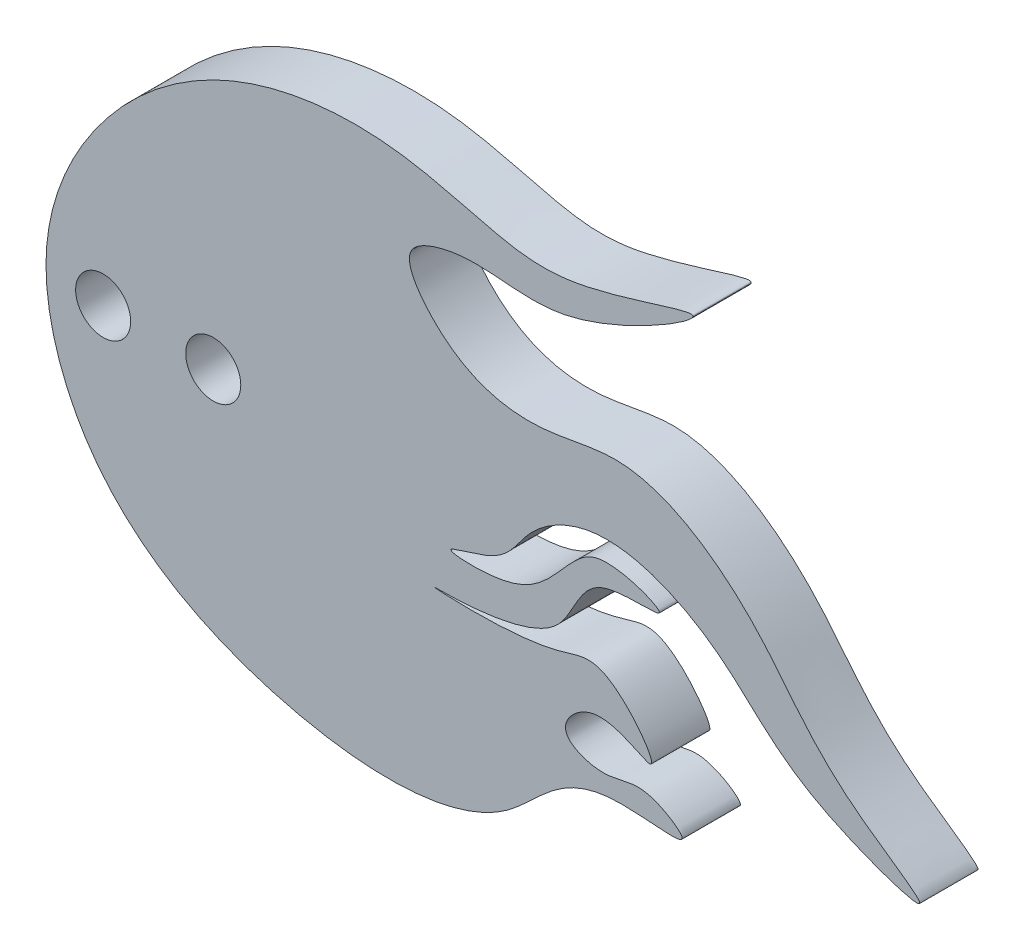
ISO-10303-21;
HEADER;
FILE_DESCRIPTION(('STEP AP214'),'2;1');
FILE_NAME('part.step','',(''),(''),'','','');
FILE_SCHEMA(('AUTOMOTIVE_DESIGN { 1 0 10303 214 1 1 1 1 }'));
ENDSEC;
DATA;
#1=APPLICATION_CONTEXT('core data for automotive mechanical design processes');
#2=APPLICATION_PROTOCOL_DEFINITION('international standard','automotive_design',2000,#1);
#3=PRODUCT_CONTEXT('',#1,'mechanical');
#4=PRODUCT('Part','Part','',(#3));
#5=PRODUCT_RELATED_PRODUCT_CATEGORY('part','',(#4));
#6=PRODUCT_DEFINITION_FORMATION('','',#4);
#7=PRODUCT_DEFINITION_CONTEXT('part definition',#1,'design');
#8=PRODUCT_DEFINITION('design','',#6,#7);
#9=PRODUCT_DEFINITION_SHAPE('','',#8);
#10=(LENGTH_UNIT() NAMED_UNIT(*) SI_UNIT(.MILLI.,.METRE.));
#11=(NAMED_UNIT(*) PLANE_ANGLE_UNIT() SI_UNIT($,.RADIAN.));
#12=(NAMED_UNIT(*) SI_UNIT($,.STERADIAN.) SOLID_ANGLE_UNIT());
#13=UNCERTAINTY_MEASURE_WITH_UNIT(LENGTH_MEASURE(1.E-05),#10,'distance_accuracy_value','');
#14=(GEOMETRIC_REPRESENTATION_CONTEXT(3) GLOBAL_UNCERTAINTY_ASSIGNED_CONTEXT((#13)) GLOBAL_UNIT_ASSIGNED_CONTEXT((#10,
#11,#12)) REPRESENTATION_CONTEXT('',''));
#15=CARTESIAN_POINT('',(0.,0.,0.));
#16=DIRECTION('',(0.,0.,1.));
#17=DIRECTION('',(1.,0.,0.));
#18=AXIS2_PLACEMENT_3D('',#15,#16,#17);
#19=CARTESIAN_POINT('',(29.2077428768986,35.7174684652818,3.175));
#20=CARTESIAN_POINT('',(27.5642303422811,35.509146655442,3.175));
#21=CARTESIAN_POINT('',(24.9194545594587,36.0169721279444,3.175));
#22=CARTESIAN_POINT('',(18.6753307864758,37.7870014132939,3.175));
#23=CARTESIAN_POINT('',(10.5214770077133,36.7204191448793,3.175));
#24=CARTESIAN_POINT('',(3.41892611378252,30.8703568550856,3.175));
#25=CARTESIAN_POINT('',(-0.13100911121442,22.8337319239157,3.175));
#26=CARTESIAN_POINT('',(3.03212716183096,12.8046463692564,3.175));
#27=CARTESIAN_POINT('',(13.1317546015147,7.10810001752549,3.175));
#28=CARTESIAN_POINT('',(25.6679835015036,6.72133108965359,3.175));
#29=CARTESIAN_POINT('',(29.4960738607848,13.3666069899736,3.175));
#30=CARTESIAN_POINT('',(37.148859705359,11.7425918737781,3.175));
#31=CARTESIAN_POINT('',(33.3021390176119,14.1945466107997,3.175));
#32=CARTESIAN_POINT('',(31.4935698264787,13.0333632037373,3.175));
#33=CARTESIAN_POINT('',(28.3005508313251,14.1846901771296,3.175));
#34=CARTESIAN_POINT('',(31.0101743734055,16.9646715676636,3.175));
#35=CARTESIAN_POINT('',(35.5425184711423,13.4421090044459,3.175));
#36=CARTESIAN_POINT('',(31.4599524723255,19.1264680640368,3.175));
#37=CARTESIAN_POINT('',(27.7324026047318,17.1992164031935,3.175));
#38=CARTESIAN_POINT('',(17.6517999529166,17.798062224782,3.175));
#39=CARTESIAN_POINT('',(29.6014462485873,17.3321197998693,3.175));
#40=CARTESIAN_POINT('',(29.8803688102288,22.8701692013179,3.175));
#41=CARTESIAN_POINT('',(36.3581060168283,21.9796559236344,3.175));
#42=CARTESIAN_POINT('',(31.3765357378755,23.9853594369947,3.175));
#43=CARTESIAN_POINT('',(28.8256720167356,22.040552062954,3.175));
#44=CARTESIAN_POINT('',(27.5941440596219,19.3932427014312,3.175));
#45=CARTESIAN_POINT('',(21.358620702928,19.6805195858477,3.175));
#46=CARTESIAN_POINT('',(25.9109447922569,20.4768127131401,3.175));
#47=CARTESIAN_POINT('',(27.0473677165389,22.9379354806894,3.175));
#48=CARTESIAN_POINT('',(31.3999746568689,25.5814508242182,3.175));
#49=CARTESIAN_POINT('',(38.1634505207187,22.4672125381511,3.175));
#50=CARTESIAN_POINT('',(41.2184010109968,18.0012305340029,3.175));
#51=CARTESIAN_POINT('',(51.025300464133,14.6557830920797,3.175));
#52=CARTESIAN_POINT('',(42.9052263983262,19.5998838849012,3.175));
#53=CARTESIAN_POINT('',(40.2831623147794,24.4995362757787,3.175));
#54=CARTESIAN_POINT('',(33.5758269863238,29.4180717588441,3.175));
#55=CARTESIAN_POINT('',(27.2854415074744,27.5251371087843,3.175));
#56=CARTESIAN_POINT('',(22.8677355510858,28.5374453478311,3.175));
#57=CARTESIAN_POINT('',(19.9029854763885,32.8523842857415,3.175));
#58=CARTESIAN_POINT('',(24.399845194518,34.6169841924745,3.175));
#59=CARTESIAN_POINT('',(28.580475886662,32.4213110285757,3.175));
#60=CARTESIAN_POINT('',(40.1958510314961,39.4826297826488,3.175));
#61=CARTESIAN_POINT('',(31.9936694350818,36.0705958375756,3.175));
#62=CARTESIAN_POINT('',(29.2077428768986,35.7174684652818,3.175));
#63=B_SPLINE_CURVE_WITH_KNOTS('',3,(#19,#20,#21,#22,#23,#24,#25,#26,#27,#28,#29,#30,#31,#32,#33,
#34,#35,#36,#37,#38,#39,#40,#41,#42,#43,#44,#45,#46,#47,#48,#49,#50,#51,#52,#53,#54,#55,#56,#57,
#58,#59,#60,#61,#62),.UNSPECIFIED.,.T.,.F.,(4,1,1,1,1,1,1,1,1,1,1,1,1,1,1,1,1,1,1,1,1,1,1,1,1,1,
1,1,1,1,1,1,1,1,1,1,1,1,1,1,1,4),(0.,0.0193135638985929,0.0410913295357131,0.0869602501780935,
0.126254160434278,0.163181020022604,0.201007587673421,0.258577406496451,0.315726187258665,
0.345346931074387,0.362814407201005,0.373276151624807,0.384073869948833,0.39432438889211,
0.404232517191732,0.41895677978106,0.437984056937605,0.449078380536206,0.479473307712668,
0.510297216766808,0.52897238998923,0.543032431315629,0.55912398746355,0.565021037800455,
0.587261649113782,0.600960416523598,0.612435153783962,0.624782142871666,0.640444271064865,
0.676051179709198,0.708184934815277,0.734710062279494,0.754186457958474,0.791600097145722,
0.830668025787946,0.849067141008229,0.878547416589547,0.892075492084488,0.900936313179609,
0.931785361006807,0.967261478409851,1.),.UNSPECIFIED.);
#64=DIRECTION('',(0.,0.,-1.));
#65=VECTOR('',#64,1.);
#66=SURFACE_OF_LINEAR_EXTRUSION('',#63,#65);
#67=CARTESIAN_POINT('',(29.2077428768986,35.7174684652818,3.175));
#68=VERTEX_POINT('',#67);
#69=EDGE_CURVE('E10',#68,#68,#63,.T.);
#70=ORIENTED_EDGE('',*,*,#69,.F.);
#71=EDGE_LOOP('',(#70));
#72=FACE_BOUND('',#71,.T.);
#73=CARTESIAN_POINT('',(29.2077428768986,35.7174684652818,0.));
#74=CARTESIAN_POINT('',(27.5642303422811,35.509146655442,0.));
#75=CARTESIAN_POINT('',(24.9194545594587,36.0169721279444,0.));
#76=CARTESIAN_POINT('',(18.6753307864758,37.7870014132939,0.));
#77=CARTESIAN_POINT('',(10.5214770077133,36.7204191448793,0.));
#78=CARTESIAN_POINT('',(3.41892611378252,30.8703568550856,0.));
#79=CARTESIAN_POINT('',(-0.13100911121442,22.8337319239157,0.));
#80=CARTESIAN_POINT('',(3.03212716183096,12.8046463692564,0.));
#81=CARTESIAN_POINT('',(13.1317546015147,7.10810001752549,0.));
#82=CARTESIAN_POINT('',(25.6679835015036,6.72133108965359,0.));
#83=CARTESIAN_POINT('',(29.4960738607848,13.3666069899736,0.));
#84=CARTESIAN_POINT('',(37.148859705359,11.7425918737781,0.));
#85=CARTESIAN_POINT('',(33.3021390176119,14.1945466107997,0.));
#86=CARTESIAN_POINT('',(31.4935698264787,13.0333632037373,0.));
#87=CARTESIAN_POINT('',(28.3005508313251,14.1846901771296,0.));
#88=CARTESIAN_POINT('',(31.0101743734055,16.9646715676636,0.));
#89=CARTESIAN_POINT('',(35.5425184711423,13.4421090044459,0.));
#90=CARTESIAN_POINT('',(31.4599524723255,19.1264680640368,0.));
#91=CARTESIAN_POINT('',(27.7324026047318,17.1992164031935,0.));
#92=CARTESIAN_POINT('',(17.6517999529166,17.798062224782,0.));
#93=CARTESIAN_POINT('',(29.6014462485873,17.3321197998693,0.));
#94=CARTESIAN_POINT('',(29.8803688102288,22.8701692013179,0.));
#95=CARTESIAN_POINT('',(36.3581060168283,21.9796559236344,0.));
#96=CARTESIAN_POINT('',(31.3765357378755,23.9853594369947,0.));
#97=CARTESIAN_POINT('',(28.8256720167356,22.040552062954,0.));
#98=CARTESIAN_POINT('',(27.5941440596219,19.3932427014312,0.));
#99=CARTESIAN_POINT('',(21.358620702928,19.6805195858477,0.));
#100=CARTESIAN_POINT('',(25.9109447922569,20.4768127131401,0.));
#101=CARTESIAN_POINT('',(27.0473677165389,22.9379354806894,0.));
#102=CARTESIAN_POINT('',(31.3999746568689,25.5814508242182,0.));
#103=CARTESIAN_POINT('',(38.1634505207187,22.4672125381511,0.));
#104=CARTESIAN_POINT('',(41.2184010109968,18.0012305340029,0.));
#105=CARTESIAN_POINT('',(51.025300464133,14.6557830920797,0.));
#106=CARTESIAN_POINT('',(42.9052263983262,19.5998838849012,0.));
#107=CARTESIAN_POINT('',(40.2831623147794,24.4995362757787,0.));
#108=CARTESIAN_POINT('',(33.5758269863238,29.4180717588441,0.));
#109=CARTESIAN_POINT('',(27.2854415074744,27.5251371087843,0.));
#110=CARTESIAN_POINT('',(22.8677355510858,28.5374453478311,0.));
#111=CARTESIAN_POINT('',(19.9029854763885,32.8523842857415,0.));
#112=CARTESIAN_POINT('',(24.399845194518,34.6169841924745,0.));
#113=CARTESIAN_POINT('',(28.580475886662,32.4213110285757,0.));
#114=CARTESIAN_POINT('',(40.1958510314961,39.4826297826488,0.));
#115=CARTESIAN_POINT('',(31.9936694350818,36.0705958375756,0.));
#116=CARTESIAN_POINT('',(29.2077428768986,35.7174684652818,0.));
#117=B_SPLINE_CURVE_WITH_KNOTS('',3,(#73,#74,#75,#76,#77,#78,#79,#80,#81,#82,#83,#84,#85,#86,
#87,#88,#89,#90,#91,#92,#93,#94,#95,#96,#97,#98,#99,#100,#101,#102,#103,#104,#105,#106,#107,
#108,#109,#110,#111,#112,#113,#114,#115,#116),.UNSPECIFIED.,.T.,.F.,(4,1,1,1,1,1,1,1,1,1,1,1,1,
1,1,1,1,1,1,1,1,1,1,1,1,1,1,1,1,1,1,1,1,1,1,1,1,1,1,1,1,4),(0.,0.0193135638985929,
0.0410913295357131,0.0869602501780935,0.126254160434278,0.163181020022604,0.201007587673421,
0.258577406496451,0.315726187258665,0.345346931074387,0.362814407201005,0.373276151624807,
0.384073869948833,0.39432438889211,0.404232517191732,0.41895677978106,0.437984056937605,
0.449078380536206,0.479473307712668,0.510297216766808,0.52897238998923,0.543032431315629,
0.55912398746355,0.565021037800455,0.587261649113782,0.600960416523598,0.612435153783962,
0.624782142871666,0.640444271064865,0.676051179709198,0.708184934815277,0.734710062279494,
0.754186457958474,0.791600097145722,0.830668025787946,0.849067141008229,0.878547416589547,
0.892075492084488,0.900936313179609,0.931785361006807,0.967261478409851,1.),.UNSPECIFIED.);
#118=CARTESIAN_POINT('',(29.2077428768986,35.7174684652818,0.));
#119=VERTEX_POINT('',#118);
#120=EDGE_CURVE('E41',#119,#119,#117,.T.);
#121=ORIENTED_EDGE('',*,*,#120,.T.);
#122=EDGE_LOOP('',(#121));
#123=FACE_BOUND('',#122,.T.);
#124=ADVANCED_FACE('F37',(#72,#123),#66,.F.);
#125=CARTESIAN_POINT('',(26.1423316913491,17.9602351243665,3.175));
#126=DIRECTION('',(0.,0.,1.));
#127=DIRECTION('',(1.,0.,0.));
#128=AXIS2_PLACEMENT_3D('',#125,#126,#127);
#129=PLANE('',#128);
#130=CARTESIAN_POINT('',(4.,21.8382228630262,3.175));
#131=DIRECTION('',(0.,0.,1.));
#132=DIRECTION('',(1.,0.,0.));
#133=AXIS2_PLACEMENT_3D('',#130,#131,#132);
#134=CIRCLE('',#133,1.5);
#135=CARTESIAN_POINT('',(5.5,21.8382228630262,3.175));
#136=VERTEX_POINT('',#135);
#137=EDGE_CURVE('E67',#136,#136,#134,.T.);
#138=ORIENTED_EDGE('',*,*,#137,.F.);
#139=EDGE_LOOP('',(#138));
#140=FACE_BOUND('',#139,.T.);
#141=CARTESIAN_POINT('',(10.,21.8382228630262,3.175));
#142=DIRECTION('',(0.,0.,1.));
#143=DIRECTION('',(1.,0.,0.));
#144=AXIS2_PLACEMENT_3D('',#141,#142,#143);
#145=CIRCLE('',#144,1.5);
#146=CARTESIAN_POINT('',(11.5,21.8382228630262,3.175));
#147=VERTEX_POINT('',#146);
#148=EDGE_CURVE('E56',#147,#147,#145,.T.);
#149=ORIENTED_EDGE('',*,*,#148,.F.);
#150=EDGE_LOOP('',(#149));
#151=FACE_BOUND('',#150,.T.);
#152=ORIENTED_EDGE('',*,*,#69,.T.);
#153=EDGE_LOOP('',(#152));
#154=FACE_BOUND('',#153,.T.);
#155=ADVANCED_FACE('F85',(#140,#151,#154),#129,.T.);
#156=CARTESIAN_POINT('',(26.1423316913491,17.9602351243665,0.));
#157=DIRECTION('',(0.,0.,1.));
#158=DIRECTION('',(1.,0.,0.));
#159=AXIS2_PLACEMENT_3D('',#156,#157,#158);
#160=PLANE('',#159);
#161=CARTESIAN_POINT('',(4.,21.8382228630262,0.));
#162=DIRECTION('',(0.,0.,1.));
#163=DIRECTION('',(1.,0.,0.));
#164=AXIS2_PLACEMENT_3D('',#161,#162,#163);
#165=CIRCLE('',#164,1.5);
#166=CARTESIAN_POINT('',(5.5,21.8382228630262,0.));
#167=VERTEX_POINT('',#166);
#168=EDGE_CURVE('E51',#167,#167,#165,.T.);
#169=ORIENTED_EDGE('',*,*,#168,.T.);
#170=EDGE_LOOP('',(#169));
#171=FACE_BOUND('',#170,.T.);
#172=CARTESIAN_POINT('',(10.,21.8382228630262,0.));
#173=DIRECTION('',(0.,0.,1.));
#174=DIRECTION('',(1.,0.,0.));
#175=AXIS2_PLACEMENT_3D('',#172,#173,#174);
#176=CIRCLE('',#175,1.5);
#177=CARTESIAN_POINT('',(11.5,21.8382228630262,0.));
#178=VERTEX_POINT('',#177);
#179=EDGE_CURVE('E63',#178,#178,#176,.T.);
#180=ORIENTED_EDGE('',*,*,#179,.T.);
#181=EDGE_LOOP('',(#180));
#182=FACE_BOUND('',#181,.T.);
#183=ORIENTED_EDGE('',*,*,#120,.F.);
#184=EDGE_LOOP('',(#183));
#185=FACE_BOUND('',#184,.T.);
#186=ADVANCED_FACE('F75',(#171,#182,#185),#160,.F.);
#187=CARTESIAN_POINT('',(10.,21.8382228630262,0.));
#188=DIRECTION('',(0.,0.,1.));
#189=DIRECTION('',(1.,0.,0.));
#190=AXIS2_PLACEMENT_3D('',#187,#188,#189);
#191=CYLINDRICAL_SURFACE('',#190,1.5);
#192=ORIENTED_EDGE('',*,*,#179,.F.);
#193=EDGE_LOOP('',(#192));
#194=FACE_BOUND('',#193,.T.);
#195=ORIENTED_EDGE('',*,*,#148,.T.);
#196=EDGE_LOOP('',(#195));
#197=FACE_BOUND('',#196,.T.);
#198=ADVANCED_FACE('F81',(#194,#197),#191,.F.);
#199=CARTESIAN_POINT('',(4.,21.8382228630262,0.));
#200=DIRECTION('',(0.,0.,1.));
#201=DIRECTION('',(1.,0.,0.));
#202=AXIS2_PLACEMENT_3D('',#199,#200,#201);
#203=CYLINDRICAL_SURFACE('',#202,1.5);
#204=ORIENTED_EDGE('',*,*,#168,.F.);
#205=EDGE_LOOP('',(#204));
#206=FACE_BOUND('',#205,.T.);
#207=ORIENTED_EDGE('',*,*,#137,.T.);
#208=EDGE_LOOP('',(#207));
#209=FACE_BOUND('',#208,.T.);
#210=ADVANCED_FACE('F78',(#206,#209),#203,.F.);
#211=CLOSED_SHELL('',(#124,#155,#186,#198,#210));
#212=MANIFOLD_SOLID_BREP('B2',#211);
#213=ADVANCED_BREP_SHAPE_REPRESENTATION('',(#18,#212),#14);
#214=SHAPE_DEFINITION_REPRESENTATION(#9,#213);
ENDSEC;
END-ISO-10303-21;
